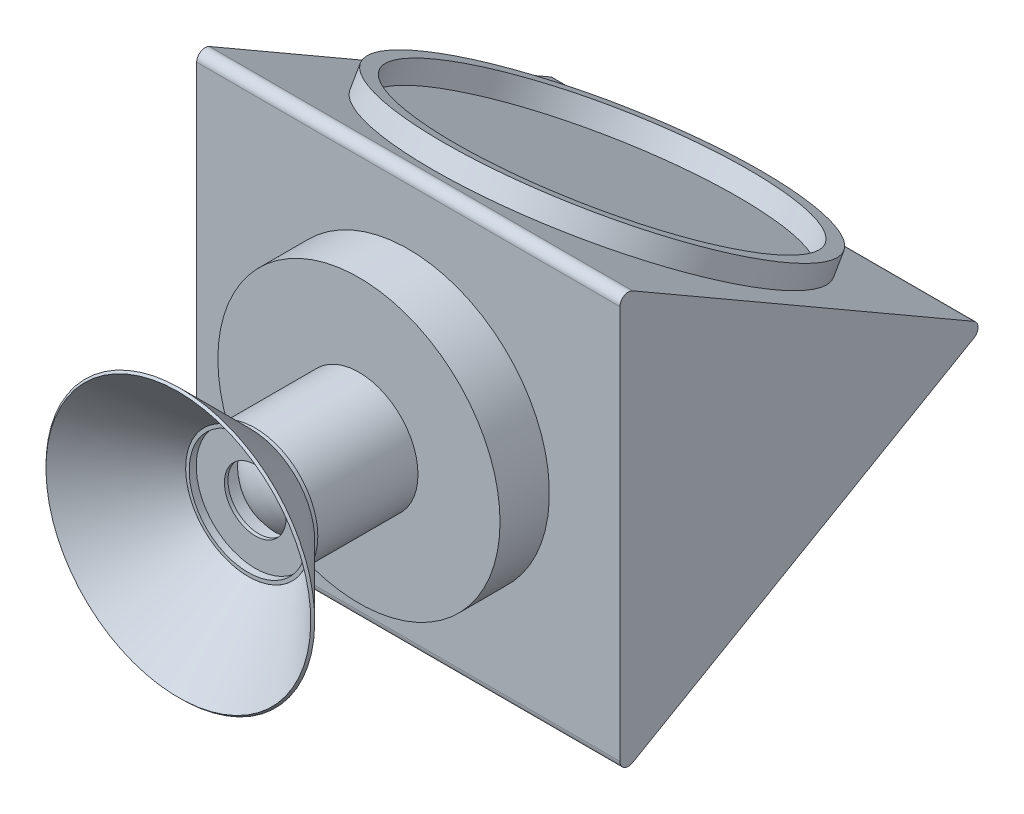
ISO-10303-21;
HEADER;
FILE_DESCRIPTION(('STEP AP214'),'2;1');
FILE_NAME('part.step','',(''),(''),'','','');
FILE_SCHEMA(('AUTOMOTIVE_DESIGN { 1 0 10303 214 1 1 1 1 }'));
ENDSEC;
DATA;
#1=APPLICATION_CONTEXT('core data for automotive mechanical design processes');
#2=APPLICATION_PROTOCOL_DEFINITION('international standard','automotive_design',2000,#1);
#3=PRODUCT_CONTEXT('',#1,'mechanical');
#4=PRODUCT('Part','Part','',(#3));
#5=PRODUCT_RELATED_PRODUCT_CATEGORY('part','',(#4));
#6=PRODUCT_DEFINITION_FORMATION('','',#4);
#7=PRODUCT_DEFINITION_CONTEXT('part definition',#1,'design');
#8=PRODUCT_DEFINITION('design','',#6,#7);
#9=PRODUCT_DEFINITION_SHAPE('','',#8);
#10=(LENGTH_UNIT() NAMED_UNIT(*) SI_UNIT(.MILLI.,.METRE.));
#11=(NAMED_UNIT(*) PLANE_ANGLE_UNIT() SI_UNIT($,.RADIAN.));
#12=(NAMED_UNIT(*) SI_UNIT($,.STERADIAN.) SOLID_ANGLE_UNIT());
#13=UNCERTAINTY_MEASURE_WITH_UNIT(LENGTH_MEASURE(1.E-05),#10,'distance_accuracy_value','');
#14=(GEOMETRIC_REPRESENTATION_CONTEXT(3) GLOBAL_UNCERTAINTY_ASSIGNED_CONTEXT((#13)) GLOBAL_UNIT_ASSIGNED_CONTEXT((#10,
#11,#12)) REPRESENTATION_CONTEXT('',''));
#15=CARTESIAN_POINT('',(0.,0.,0.));
#16=DIRECTION('',(0.,0.,1.));
#17=DIRECTION('',(1.,0.,0.));
#18=AXIS2_PLACEMENT_3D('',#15,#16,#17);
#19=CARTESIAN_POINT('',(750.,749.999999999999,560.428932188134));
#20=DIRECTION('',(0.,0.,1.));
#21=DIRECTION('',(0.,-1.,0.));
#22=AXIS2_PLACEMENT_3D('',#19,#20,#21);
#23=CONICAL_SURFACE('',#22,228.816947036011,0.785398163397448);
#24=CARTESIAN_POINT('',(750.,750.,807.916305603426));
#25=DIRECTION('',(0.,0.,-1.));
#26=DIRECTION('',(0.,1.,0.));
#27=AXIS2_PLACEMENT_3D('',#24,#25,#26);
#28=CIRCLE('',#27,476.304320451303);
#29=CARTESIAN_POINT('',(750.,1226.3043204513,807.916305603426));
#30=VERTEX_POINT('',#29);
#31=EDGE_CURVE('E78',#30,#30,#28,.T.);
#32=ORIENTED_EDGE('',*,*,#31,.T.);
#33=EDGE_LOOP('',(#32));
#34=FACE_BOUND('',#33,.T.);
#35=CARTESIAN_POINT('',(750.,749.999999999999,560.428932188134));
#36=DIRECTION('',(0.,0.,-1.));
#37=DIRECTION('',(0.,1.,0.));
#38=AXIS2_PLACEMENT_3D('',#35,#36,#37);
#39=CIRCLE('',#38,228.816947036011);
#40=CARTESIAN_POINT('',(750.,978.81694703601,560.428932188134));
#41=VERTEX_POINT('',#40);
#42=EDGE_CURVE('E12',#41,#41,#39,.T.);
#43=ORIENTED_EDGE('',*,*,#42,.F.);
#44=EDGE_LOOP('',(#43));
#45=FACE_BOUND('',#44,.T.);
#46=ADVANCED_FACE('F64',(#34,#45),#23,.T.);
#47=CARTESIAN_POINT('',(750.,749.999999999999,560.428932188134));
#48=DIRECTION('',(0.,0.,-1.));
#49=DIRECTION('',(0.,1.,0.));
#50=AXIS2_PLACEMENT_3D('',#47,#48,#49);
#51=CONICAL_SURFACE('',#50,228.816947036011,0.785398163397433);
#52=CARTESIAN_POINT('',(750.,749.999999999999,567.5));
#53=DIRECTION('',(0.,0.,-1.));
#54=DIRECTION('',(0.,1.,0.));
#55=AXIS2_PLACEMENT_3D('',#52,#53,#54);
#56=CIRCLE('',#55,221.745879224146);
#57=CARTESIAN_POINT('',(750.,971.745879224145,567.5));
#58=VERTEX_POINT('',#57);
#59=EDGE_CURVE('E70',#58,#58,#56,.T.);
#60=ORIENTED_EDGE('',*,*,#59,.F.);
#61=EDGE_LOOP('',(#60));
#62=FACE_BOUND('',#61,.T.);
#63=ORIENTED_EDGE('',*,*,#42,.T.);
#64=EDGE_LOOP('',(#63));
#65=FACE_BOUND('',#64,.T.);
#66=ADVANCED_FACE('F94',(#62,#65),#51,.F.);
#67=CARTESIAN_POINT('',(750.,749.999999999999,567.5));
#68=DIRECTION('',(0.,0.,1.));
#69=DIRECTION('',(0.,-1.,0.));
#70=AXIS2_PLACEMENT_3D('',#67,#68,#69);
#71=CONICAL_SURFACE('',#70,221.745879224146,0.785398163397449);
#72=CARTESIAN_POINT('',(750.,750.,814.987373415291));
#73=DIRECTION('',(0.,0.,-1.));
#74=DIRECTION('',(0.,1.,0.));
#75=AXIS2_PLACEMENT_3D('',#72,#73,#74);
#76=CIRCLE('',#75,469.233252639437);
#77=CARTESIAN_POINT('',(750.,1219.23325263944,814.987373415291));
#78=VERTEX_POINT('',#77);
#79=EDGE_CURVE('E74',#78,#78,#76,.T.);
#80=ORIENTED_EDGE('',*,*,#79,.F.);
#81=EDGE_LOOP('',(#80));
#82=FACE_BOUND('',#81,.T.);
#83=ORIENTED_EDGE('',*,*,#59,.T.);
#84=EDGE_LOOP('',(#83));
#85=FACE_BOUND('',#84,.T.);
#86=ADVANCED_FACE('F89',(#82,#85),#71,.F.);
#87=CARTESIAN_POINT('',(750.,750.,814.987373415291));
#88=DIRECTION('',(0.,0.,-1.));
#89=DIRECTION('',(0.,1.,0.));
#90=AXIS2_PLACEMENT_3D('',#87,#88,#89);
#91=CONICAL_SURFACE('',#90,469.233252639437,0.785398163397464);
#92=ORIENTED_EDGE('',*,*,#31,.F.);
#93=EDGE_LOOP('',(#92));
#94=FACE_BOUND('',#93,.T.);
#95=ORIENTED_EDGE('',*,*,#79,.T.);
#96=EDGE_LOOP('',(#95));
#97=FACE_BOUND('',#96,.T.);
#98=ADVANCED_FACE('F86',(#94,#97),#91,.T.);
#99=CLOSED_SHELL('',(#46,#66,#86,#98));
#100=MANIFOLD_SOLID_BREP('B2',#99);
#101=CARTESIAN_POINT('',(750.,750.,567.5));
#102=DIRECTION('',(0.,0.,1.));
#103=DIRECTION('',(1.,0.,0.));
#104=AXIS2_PLACEMENT_3D('',#101,#102,#103);
#105=PLANE('',#104);
#106=CARTESIAN_POINT('',(750.,750.,567.5));
#107=DIRECTION('',(0.,0.,1.));
#108=DIRECTION('',(1.,0.,0.));
#109=AXIS2_PLACEMENT_3D('',#106,#107,#108);
#110=CIRCLE('',#109,221.745879224145);
#111=CARTESIAN_POINT('',(971.745879224145,750.,567.5));
#112=VERTEX_POINT('',#111);
#113=EDGE_CURVE('E63',#112,#112,#110,.T.);
#114=ORIENTED_EDGE('',*,*,#113,.T.);
#115=EDGE_LOOP('',(#114));
#116=FACE_BOUND('',#115,.T.);
#117=CARTESIAN_POINT('',(750.,750.,567.5));
#118=DIRECTION('',(0.,0.,1.));
#119=DIRECTION('',(1.,0.,0.));
#120=AXIS2_PLACEMENT_3D('',#117,#118,#119);
#121=CIRCLE('',#120,209.245879224145);
#122=CARTESIAN_POINT('',(959.245879224145,750.,567.5));
#123=VERTEX_POINT('',#122);
#124=EDGE_CURVE('E162',#123,#123,#121,.T.);
#125=ORIENTED_EDGE('',*,*,#124,.F.);
#126=EDGE_LOOP('',(#125));
#127=FACE_BOUND('',#126,.T.);
#128=ADVANCED_FACE('F151',(#116,#127),#105,.T.);
#129=CARTESIAN_POINT('',(750.,750.,542.5));
#130=DIRECTION('',(0.,0.,1.));
#131=DIRECTION('',(1.,0.,0.));
#132=AXIS2_PLACEMENT_3D('',#129,#130,#131);
#133=PLANE('',#132);
#134=CARTESIAN_POINT('',(750.,750.,542.5));
#135=DIRECTION('',(0.,0.,1.));
#136=DIRECTION('',(1.,0.,0.));
#137=AXIS2_PLACEMENT_3D('',#134,#135,#136);
#138=CIRCLE('',#137,221.745879224145);
#139=CARTESIAN_POINT('',(971.745879224145,750.,542.5));
#140=VERTEX_POINT('',#139);
#141=EDGE_CURVE('E155',#140,#140,#138,.T.);
#142=ORIENTED_EDGE('',*,*,#141,.F.);
#143=EDGE_LOOP('',(#142));
#144=FACE_BOUND('',#143,.T.);
#145=CARTESIAN_POINT('',(750.,750.,542.5));
#146=DIRECTION('',(0.,0.,1.));
#147=DIRECTION('',(1.,0.,0.));
#148=AXIS2_PLACEMENT_3D('',#145,#146,#147);
#149=CIRCLE('',#148,209.245879224145);
#150=CARTESIAN_POINT('',(959.245879224145,750.,542.5));
#151=VERTEX_POINT('',#150);
#152=EDGE_CURVE('E164',#151,#151,#149,.T.);
#153=ORIENTED_EDGE('',*,*,#152,.T.);
#154=EDGE_LOOP('',(#153));
#155=FACE_BOUND('',#154,.T.);
#156=ADVANCED_FACE('F174',(#144,#155),#133,.F.);
#157=CARTESIAN_POINT('',(750.,750.,567.5));
#158=DIRECTION('',(0.,0.,-1.));
#159=DIRECTION('',(-1.,0.,0.));
#160=AXIS2_PLACEMENT_3D('',#157,#158,#159);
#161=CYLINDRICAL_SURFACE('',#160,221.745879224145);
#162=ORIENTED_EDGE('',*,*,#113,.F.);
#163=EDGE_LOOP('',(#162));
#164=FACE_BOUND('',#163,.T.);
#165=ORIENTED_EDGE('',*,*,#141,.T.);
#166=EDGE_LOOP('',(#165));
#167=FACE_BOUND('',#166,.T.);
#168=ADVANCED_FACE('F153',(#164,#167),#161,.T.);
#169=CARTESIAN_POINT('',(750.,750.,567.5));
#170=DIRECTION('',(0.,0.,-1.));
#171=DIRECTION('',(-1.,0.,0.));
#172=AXIS2_PLACEMENT_3D('',#169,#170,#171);
#173=CYLINDRICAL_SURFACE('',#172,209.245879224145);
#174=ORIENTED_EDGE('',*,*,#124,.T.);
#175=EDGE_LOOP('',(#174));
#176=FACE_BOUND('',#175,.T.);
#177=ORIENTED_EDGE('',*,*,#152,.F.);
#178=EDGE_LOOP('',(#177));
#179=FACE_BOUND('',#178,.T.);
#180=ADVANCED_FACE('F170',(#176,#179),#173,.F.);
#181=CLOSED_SHELL('',(#128,#156,#168,#180));
#182=MANIFOLD_SOLID_BREP('B7',#181);
#183=CARTESIAN_POINT('',(1500.,749.999999999997,-1299.03810567666));
#184=DIRECTION('',(0.,0.86602540378444,0.499999999999998));
#185=DIRECTION('',(0.,-0.499999999999998,0.86602540378444));
#186=AXIS2_PLACEMENT_3D('',#183,#184,#185);
#187=PLANE('',#186);
#188=DIRECTION('',(0.,0.499999999999998,-0.86602540378444));
#189=VECTOR('',#188,1.);
#190=CARTESIAN_POINT('',(1500.,749.999999999997,-1299.03810567666));
#191=LINE('',#190,#189);
#192=CARTESIAN_POINT('',(1500.,25.9807621135332,-45.0000000000004));
#193=VERTEX_POINT('',#192);
#194=CARTESIAN_POINT('',(1500.,724.019237886464,-1254.03810567666));
#195=VERTEX_POINT('',#194);
#196=EDGE_CURVE('E304',#193,#195,#191,.T.);
#197=ORIENTED_EDGE('',*,*,#196,.F.);
#198=DIRECTION('',(-1.,0.,0.));
#199=VECTOR('',#198,1.);
#200=CARTESIAN_POINT('',(1500.,25.9807621135328,-44.9999999999997));
#201=LINE('',#200,#199);
#202=CARTESIAN_POINT('',(0.,25.9807621135332,-45.0000000000004));
#203=VERTEX_POINT('',#202);
#204=EDGE_CURVE('E318',#193,#203,#201,.T.);
#205=ORIENTED_EDGE('',*,*,#204,.T.);
#206=DIRECTION('',(0.,0.499999999999998,-0.86602540378444));
#207=VECTOR('',#206,1.);
#208=CARTESIAN_POINT('',(0.,749.999999999997,-1299.03810567666));
#209=LINE('',#208,#207);
#210=CARTESIAN_POINT('',(0.,724.019237886464,-1254.03810567666));
#211=VERTEX_POINT('',#210);
#212=EDGE_CURVE('E309',#203,#211,#209,.T.);
#213=ORIENTED_EDGE('',*,*,#212,.T.);
#214=DIRECTION('',(-1.,0.,0.));
#215=VECTOR('',#214,1.);
#216=CARTESIAN_POINT('',(1500.,724.019237886464,-1254.03810567666));
#217=LINE('',#216,#215);
#218=EDGE_CURVE('E316',#211,#195,#217,.F.);
#219=ORIENTED_EDGE('',*,*,#218,.T.);
#220=EDGE_LOOP('',(#197,#205,#213,#219));
#221=FACE_BOUND('',#220,.T.);
#222=ADVANCED_FACE('F229',(#221),#187,.F.);
#223=CARTESIAN_POINT('',(1500.,1500.,0.));
#224=DIRECTION('',(0.,-0.866025403784438,0.500000000000001));
#225=DIRECTION('',(0.,-0.500000000000001,-0.866025403784438));
#226=AXIS2_PLACEMENT_3D('',#223,#224,#225);
#227=PLANE('',#226);
#228=CARTESIAN_POINT('',(750.,1125.,-649.51905283833));
#229=DIRECTION('',(0.,-0.866025403784438,0.500000000000001));
#230=DIRECTION('',(0.,-0.500000000000001,-0.866025403784438));
#231=AXIS2_PLACEMENT_3D('',#228,#229,#230);
#232=CIRCLE('',#231,650.);
#233=CARTESIAN_POINT('',(750.,799.999999999998,-1212.43556529822));
#234=VERTEX_POINT('',#233);
#235=EDGE_CURVE('E149',#234,#234,#232,.F.);
#236=ORIENTED_EDGE('',*,*,#235,.F.);
#237=EDGE_LOOP('',(#236));
#238=FACE_BOUND('',#237,.T.);
#239=DIRECTION('',(0.,0.500000000000001,0.866025403784438));
#240=VECTOR('',#239,1.);
#241=CARTESIAN_POINT('',(1500.,1500.,0.));
#242=LINE('',#241,#240);
#243=CARTESIAN_POINT('',(1500.,775.98076211353,-1254.03810567666));
#244=VERTEX_POINT('',#243);
#245=CARTESIAN_POINT('',(1500.,1474.01923788647,-45.));
#246=VERTEX_POINT('',#245);
#247=EDGE_CURVE('E307',#244,#246,#242,.T.);
#248=ORIENTED_EDGE('',*,*,#247,.F.);
#249=DIRECTION('',(-1.,0.,0.));
#250=VECTOR('',#249,1.);
#251=CARTESIAN_POINT('',(1500.,775.98076211353,-1254.03810567666));
#252=LINE('',#251,#250);
#253=CARTESIAN_POINT('',(0.,775.98076211353,-1254.03810567666));
#254=VERTEX_POINT('',#253);
#255=EDGE_CURVE('E328',#244,#254,#252,.T.);
#256=ORIENTED_EDGE('',*,*,#255,.T.);
#257=DIRECTION('',(0.,0.500000000000001,0.866025403784438));
#258=VECTOR('',#257,1.);
#259=CARTESIAN_POINT('',(0.,1500.,0.));
#260=LINE('',#259,#258);
#261=CARTESIAN_POINT('',(0.,1474.01923788647,-45.));
#262=VERTEX_POINT('',#261);
#263=EDGE_CURVE('E305',#254,#262,#260,.T.);
#264=ORIENTED_EDGE('',*,*,#263,.T.);
#265=DIRECTION('',(-1.,0.,0.));
#266=VECTOR('',#265,1.);
#267=CARTESIAN_POINT('',(1500.,1474.01923788647,-45.));
#268=LINE('',#267,#266);
#269=EDGE_CURVE('E292',#262,#246,#268,.F.);
#270=ORIENTED_EDGE('',*,*,#269,.T.);
#271=EDGE_LOOP('',(#248,#256,#264,#270));
#272=FACE_BOUND('',#271,.T.);
#273=ADVANCED_FACE('F364',(#238,#272),#227,.F.);
#274=CARTESIAN_POINT('',(1500.,0.,0.));
#275=DIRECTION('',(0.,0.,-1.));
#276=DIRECTION('',(-1.,0.,0.));
#277=AXIS2_PLACEMENT_3D('',#274,#275,#276);
#278=PLANE('',#277);
#279=CARTESIAN_POINT('',(750.,750.,0.));
#280=DIRECTION('',(0.,0.,-1.));
#281=DIRECTION('',(-1.,0.,0.));
#282=AXIS2_PLACEMENT_3D('',#279,#280,#281);
#283=CIRCLE('',#282,500.);
#284=CARTESIAN_POINT('',(250.,750.,0.));
#285=VERTEX_POINT('',#284);
#286=EDGE_CURVE('E331',#285,#285,#283,.F.);
#287=ORIENTED_EDGE('',*,*,#286,.F.);
#288=EDGE_LOOP('',(#287));
#289=FACE_BOUND('',#288,.T.);
#290=DIRECTION('',(0.,-1.,0.));
#291=VECTOR('',#290,1.);
#292=CARTESIAN_POINT('',(0.,0.,0.));
#293=LINE('',#292,#291);
#294=CARTESIAN_POINT('',(0.,1448.03847577293,0.));
#295=VERTEX_POINT('',#294);
#296=CARTESIAN_POINT('',(0.,51.9615242270661,0.));
#297=VERTEX_POINT('',#296);
#298=EDGE_CURVE('E298',#295,#297,#293,.T.);
#299=ORIENTED_EDGE('',*,*,#298,.T.);
#300=DIRECTION('',(-1.,0.,0.));
#301=VECTOR('',#300,1.);
#302=CARTESIAN_POINT('',(1500.,51.9615242270661,0.));
#303=LINE('',#302,#301);
#304=CARTESIAN_POINT('',(1500.,51.9615242270661,0.));
#305=VERTEX_POINT('',#304);
#306=EDGE_CURVE('E252',#297,#305,#303,.F.);
#307=ORIENTED_EDGE('',*,*,#306,.T.);
#308=DIRECTION('',(0.,-1.,0.));
#309=VECTOR('',#308,1.);
#310=CARTESIAN_POINT('',(1500.,0.,0.));
#311=LINE('',#310,#309);
#312=CARTESIAN_POINT('',(1500.,1448.03847577293,0.));
#313=VERTEX_POINT('',#312);
#314=EDGE_CURVE('E299',#313,#305,#311,.T.);
#315=ORIENTED_EDGE('',*,*,#314,.F.);
#316=DIRECTION('',(-1.,0.,0.));
#317=VECTOR('',#316,1.);
#318=CARTESIAN_POINT('',(1500.,1448.03847577293,0.));
#319=LINE('',#318,#317);
#320=EDGE_CURVE('E290',#313,#295,#319,.T.);
#321=ORIENTED_EDGE('',*,*,#320,.T.);
#322=EDGE_LOOP('',(#299,#307,#315,#321));
#323=FACE_BOUND('',#322,.T.);
#324=ADVANCED_FACE('F297',(#289,#323),#278,.F.);
#325=CARTESIAN_POINT('',(1500.,0.,0.));
#326=DIRECTION('',(-1.,0.,0.));
#327=DIRECTION('',(0.,0.,1.));
#328=AXIS2_PLACEMENT_3D('',#325,#326,#327);
#329=PLANE('',#328);
#330=ORIENTED_EDGE('',*,*,#314,.T.);
#331=CARTESIAN_POINT('',(1500.,51.9615242270661,-30.));
#332=DIRECTION('',(-1.,0.,0.));
#333=DIRECTION('',(0.,0.,1.));
#334=AXIS2_PLACEMENT_3D('',#331,#332,#333);
#335=CIRCLE('',#334,30.);
#336=EDGE_CURVE('E326',#305,#193,#335,.F.);
#337=ORIENTED_EDGE('',*,*,#336,.T.);
#338=ORIENTED_EDGE('',*,*,#196,.T.);
#339=CARTESIAN_POINT('',(1500.,749.999999999997,-1239.03810567666));
#340=DIRECTION('',(-1.,0.,0.));
#341=DIRECTION('',(0.,0.,1.));
#342=AXIS2_PLACEMENT_3D('',#339,#340,#341);
#343=CIRCLE('',#342,30.);
#344=EDGE_CURVE('E244',#195,#244,#343,.F.);
#345=ORIENTED_EDGE('',*,*,#344,.T.);
#346=ORIENTED_EDGE('',*,*,#247,.T.);
#347=CARTESIAN_POINT('',(1500.,1448.03847577293,-30.));
#348=DIRECTION('',(-1.,0.,0.));
#349=DIRECTION('',(0.,0.,1.));
#350=AXIS2_PLACEMENT_3D('',#347,#348,#349);
#351=CIRCLE('',#350,30.);
#352=EDGE_CURVE('E314',#246,#313,#351,.F.);
#353=ORIENTED_EDGE('',*,*,#352,.T.);
#354=EDGE_LOOP('',(#330,#337,#338,#345,#346,#353));
#355=FACE_BOUND('',#354,.T.);
#356=ADVANCED_FACE('F386',(#355),#329,.F.);
#357=CARTESIAN_POINT('',(0.,0.,0.));
#358=DIRECTION('',(-1.,0.,0.));
#359=DIRECTION('',(0.,0.,1.));
#360=AXIS2_PLACEMENT_3D('',#357,#358,#359);
#361=PLANE('',#360);
#362=ORIENTED_EDGE('',*,*,#212,.F.);
#363=CARTESIAN_POINT('',(0.,51.9615242270661,-30.));
#364=DIRECTION('',(-1.,0.,0.));
#365=DIRECTION('',(0.,0.,1.));
#366=AXIS2_PLACEMENT_3D('',#363,#364,#365);
#367=CIRCLE('',#366,30.);
#368=EDGE_CURVE('E303',#203,#297,#367,.T.);
#369=ORIENTED_EDGE('',*,*,#368,.T.);
#370=ORIENTED_EDGE('',*,*,#298,.F.);
#371=CARTESIAN_POINT('',(0.,1448.03847577293,-30.));
#372=DIRECTION('',(-1.,0.,0.));
#373=DIRECTION('',(0.,0.,1.));
#374=AXIS2_PLACEMENT_3D('',#371,#372,#373);
#375=CIRCLE('',#374,30.);
#376=EDGE_CURVE('E286',#295,#262,#375,.T.);
#377=ORIENTED_EDGE('',*,*,#376,.T.);
#378=ORIENTED_EDGE('',*,*,#263,.F.);
#379=CARTESIAN_POINT('',(0.,749.999999999997,-1239.03810567666));
#380=DIRECTION('',(-1.,0.,0.));
#381=DIRECTION('',(0.,0.,1.));
#382=AXIS2_PLACEMENT_3D('',#379,#380,#381);
#383=CIRCLE('',#382,30.);
#384=EDGE_CURVE('E321',#254,#211,#383,.T.);
#385=ORIENTED_EDGE('',*,*,#384,.T.);
#386=EDGE_LOOP('',(#362,#369,#370,#377,#378,#385));
#387=FACE_BOUND('',#386,.T.);
#388=ADVANCED_FACE('F302',(#387),#361,.T.);
#389=CARTESIAN_POINT('',(1500.,1448.03847577293,-30.));
#390=DIRECTION('',(-1.,0.,0.));
#391=DIRECTION('',(0.,0.,1.));
#392=AXIS2_PLACEMENT_3D('',#389,#390,#391);
#393=CYLINDRICAL_SURFACE('',#392,30.);
#394=ORIENTED_EDGE('',*,*,#352,.F.);
#395=ORIENTED_EDGE('',*,*,#269,.F.);
#396=ORIENTED_EDGE('',*,*,#376,.F.);
#397=ORIENTED_EDGE('',*,*,#320,.F.);
#398=EDGE_LOOP('',(#394,#395,#396,#397));
#399=FACE_BOUND('',#398,.T.);
#400=ADVANCED_FACE('F289',(#399),#393,.T.);
#401=CARTESIAN_POINT('',(1500.,51.9615242270661,-30.));
#402=DIRECTION('',(-1.,0.,0.));
#403=DIRECTION('',(0.,0.,1.));
#404=AXIS2_PLACEMENT_3D('',#401,#402,#403);
#405=CYLINDRICAL_SURFACE('',#404,30.);
#406=ORIENTED_EDGE('',*,*,#336,.F.);
#407=ORIENTED_EDGE('',*,*,#306,.F.);
#408=ORIENTED_EDGE('',*,*,#368,.F.);
#409=ORIENTED_EDGE('',*,*,#204,.F.);
#410=EDGE_LOOP('',(#406,#407,#408,#409));
#411=FACE_BOUND('',#410,.T.);
#412=ADVANCED_FACE('F377',(#411),#405,.T.);
#413=CARTESIAN_POINT('',(1500.,749.999999999997,-1239.03810567666));
#414=DIRECTION('',(-1.,0.,0.));
#415=DIRECTION('',(0.,0.,1.));
#416=AXIS2_PLACEMENT_3D('',#413,#414,#415);
#417=CYLINDRICAL_SURFACE('',#416,30.);
#418=ORIENTED_EDGE('',*,*,#344,.F.);
#419=ORIENTED_EDGE('',*,*,#218,.F.);
#420=ORIENTED_EDGE('',*,*,#384,.F.);
#421=ORIENTED_EDGE('',*,*,#255,.F.);
#422=EDGE_LOOP('',(#418,#419,#420,#421));
#423=FACE_BOUND('',#422,.T.);
#424=ADVANCED_FACE('F231',(#423),#417,.T.);
#425=CARTESIAN_POINT('',(750.,750.,175.));
#426=DIRECTION('',(0.,0.,-1.));
#427=DIRECTION('',(-1.,0.,0.));
#428=AXIS2_PLACEMENT_3D('',#425,#426,#427);
#429=CYLINDRICAL_SURFACE('',#428,500.);
#430=CARTESIAN_POINT('',(750.,750.,175.));
#431=DIRECTION('',(0.,0.,1.));
#432=DIRECTION('',(1.,0.,0.));
#433=AXIS2_PLACEMENT_3D('',#430,#431,#432);
#434=CIRCLE('',#433,500.);
#435=CARTESIAN_POINT('',(1250.,750.,175.));
#436=VERTEX_POINT('',#435);
#437=EDGE_CURVE('E391',#436,#436,#434,.T.);
#438=ORIENTED_EDGE('',*,*,#437,.F.);
#439=EDGE_LOOP('',(#438));
#440=FACE_BOUND('',#439,.T.);
#441=ORIENTED_EDGE('',*,*,#286,.T.);
#442=EDGE_LOOP('',(#441));
#443=FACE_BOUND('',#442,.T.);
#444=ADVANCED_FACE('F361',(#440,#443),#429,.T.);
#445=CARTESIAN_POINT('',(750.,750.,175.));
#446=DIRECTION('',(0.,0.,1.));
#447=DIRECTION('',(1.,0.,0.));
#448=AXIS2_PLACEMENT_3D('',#445,#446,#447);
#449=PLANE('',#448);
#450=CARTESIAN_POINT('',(750.,749.999999999997,175.));
#451=DIRECTION('',(0.,0.,1.));
#452=DIRECTION('',(1.,0.,0.));
#453=AXIS2_PLACEMENT_3D('',#450,#451,#452);
#454=CIRCLE('',#453,209.245879224143);
#455=CARTESIAN_POINT('',(959.245879224143,749.999999999997,175.));
#456=VERTEX_POINT('',#455);
#457=EDGE_CURVE('E402',#456,#456,#454,.T.);
#458=ORIENTED_EDGE('',*,*,#457,.F.);
#459=EDGE_LOOP('',(#458));
#460=FACE_BOUND('',#459,.T.);
#461=ORIENTED_EDGE('',*,*,#437,.T.);
#462=EDGE_LOOP('',(#461));
#463=FACE_BOUND('',#462,.T.);
#464=ADVANCED_FACE('F343',(#460,#463),#449,.T.);
#465=CARTESIAN_POINT('',(750.,749.999999999997,530.));
#466=DIRECTION('',(0.,0.,-1.));
#467=DIRECTION('',(-1.,0.,0.));
#468=AXIS2_PLACEMENT_3D('',#465,#466,#467);
#469=CYLINDRICAL_SURFACE('',#468,209.245879224143);
#470=ORIENTED_EDGE('',*,*,#457,.T.);
#471=EDGE_LOOP('',(#470));
#472=FACE_BOUND('',#471,.T.);
#473=CARTESIAN_POINT('',(750.,750.,542.5));
#474=DIRECTION('',(0.,0.,1.));
#475=DIRECTION('',(1.,0.,0.));
#476=AXIS2_PLACEMENT_3D('',#473,#474,#475);
#477=CIRCLE('',#476,209.245879224145);
#478=CARTESIAN_POINT('',(959.245879224144,750.,542.5));
#479=VERTEX_POINT('',#478);
#480=EDGE_CURVE('E408',#479,#479,#477,.T.);
#481=ORIENTED_EDGE('',*,*,#480,.F.);
#482=EDGE_LOOP('',(#481));
#483=FACE_BOUND('',#482,.T.);
#484=ADVANCED_FACE('F360',(#472,#483),#469,.T.);
#485=CARTESIAN_POINT('',(750.,750.,530.));
#486=DIRECTION('',(0.,0.,1.));
#487=DIRECTION('',(1.,0.,0.));
#488=AXIS2_PLACEMENT_3D('',#485,#486,#487);
#489=PLANE('',#488);
#490=CARTESIAN_POINT('',(750.,750.,530.));
#491=DIRECTION('',(0.,0.,1.));
#492=DIRECTION('',(1.,0.,0.));
#493=AXIS2_PLACEMENT_3D('',#490,#491,#492);
#494=CIRCLE('',#493,109.245879224145);
#495=CARTESIAN_POINT('',(859.245879224145,750.,530.));
#496=VERTEX_POINT('',#495);
#497=EDGE_CURVE('E412',#496,#496,#494,.T.);
#498=ORIENTED_EDGE('',*,*,#497,.T.);
#499=EDGE_LOOP('',(#498));
#500=FACE_BOUND('',#499,.T.);
#501=CARTESIAN_POINT('',(750.,749.999999999997,530.));
#502=DIRECTION('',(0.,0.,1.));
#503=DIRECTION('',(1.,0.,0.));
#504=AXIS2_PLACEMENT_3D('',#501,#502,#503);
#505=CIRCLE('',#504,199.245879224143);
#506=CARTESIAN_POINT('',(949.245879224143,749.999999999997,530.));
#507=VERTEX_POINT('',#506);
#508=EDGE_CURVE('E405',#507,#507,#505,.T.);
#509=ORIENTED_EDGE('',*,*,#508,.F.);
#510=EDGE_LOOP('',(#509));
#511=FACE_BOUND('',#510,.T.);
#512=ADVANCED_FACE('F449',(#500,#511),#489,.F.);
#513=CARTESIAN_POINT('',(750.,750.,542.5));
#514=DIRECTION('',(0.,0.,1.));
#515=DIRECTION('',(1.,0.,0.));
#516=AXIS2_PLACEMENT_3D('',#513,#514,#515);
#517=PLANE('',#516);
#518=ORIENTED_EDGE('',*,*,#480,.T.);
#519=EDGE_LOOP('',(#518));
#520=FACE_BOUND('',#519,.T.);
#521=CARTESIAN_POINT('',(750.,750.,542.5));
#522=DIRECTION('',(0.,0.,1.));
#523=DIRECTION('',(1.,0.,0.));
#524=AXIS2_PLACEMENT_3D('',#521,#522,#523);
#525=CIRCLE('',#524,109.245879224145);
#526=CARTESIAN_POINT('',(859.245879224145,750.,542.5));
#527=VERTEX_POINT('',#526);
#528=EDGE_CURVE('E411',#527,#527,#525,.T.);
#529=ORIENTED_EDGE('',*,*,#528,.F.);
#530=EDGE_LOOP('',(#529));
#531=FACE_BOUND('',#530,.T.);
#532=ADVANCED_FACE('F445',(#520,#531),#517,.T.);
#533=CARTESIAN_POINT('',(750.,750.,542.5));
#534=DIRECTION('',(0.,0.,-1.));
#535=DIRECTION('',(-1.,0.,0.));
#536=AXIS2_PLACEMENT_3D('',#533,#534,#535);
#537=CYLINDRICAL_SURFACE('',#536,109.245879224145);
#538=ORIENTED_EDGE('',*,*,#528,.T.);
#539=EDGE_LOOP('',(#538));
#540=FACE_BOUND('',#539,.T.);
#541=ORIENTED_EDGE('',*,*,#497,.F.);
#542=EDGE_LOOP('',(#541));
#543=FACE_BOUND('',#542,.T.);
#544=ADVANCED_FACE('F442',(#540,#543),#537,.F.);
#545=CARTESIAN_POINT('',(750.,749.999999999997,330.971453986437));
#546=DIRECTION('',(0.,0.,-1.));
#547=DIRECTION('',(0.,1.,0.));
#548=AXIS2_PLACEMENT_3D('',#545,#546,#547);
#549=SPHERICAL_SURFACE('',#548,194.028546013563);
#550=CARTESIAN_POINT('',(750.,749.999999999998,424.999999999999));
#551=DIRECTION('',(0.,0.,-1.));
#552=DIRECTION('',(0.,1.,0.));
#553=AXIS2_PLACEMENT_3D('',#550,#551,#552);
#554=CIRCLE('',#553,169.722447551031);
#555=CARTESIAN_POINT('',(750.,919.722447551029,425.));
#556=VERTEX_POINT('',#555);
#557=EDGE_CURVE('E393',#556,#556,#554,.T.);
#558=ORIENTED_EDGE('',*,*,#557,.F.);
#559=EDGE_LOOP('',(#558));
#560=FACE_BOUND('',#559,.T.);
#561=ADVANCED_FACE('F353',(#560),#549,.T.);
#562=CARTESIAN_POINT('',(750.,750.,175.));
#563=DIRECTION('',(0.,0.,-1.));
#564=DIRECTION('',(0.,1.,0.));
#565=AXIS2_PLACEMENT_3D('',#562,#563,#564);
#566=CYLINDRICAL_SURFACE('',#565,169.72244755103);
#567=ORIENTED_EDGE('',*,*,#557,.T.);
#568=EDGE_LOOP('',(#567));
#569=FACE_BOUND('',#568,.T.);
#570=CARTESIAN_POINT('',(750.,750.,174.999999999999));
#571=DIRECTION('',(0.,0.,-1.));
#572=DIRECTION('',(0.,1.,0.));
#573=AXIS2_PLACEMENT_3D('',#570,#571,#572);
#574=CIRCLE('',#573,169.722447551029);
#575=CARTESIAN_POINT('',(750.,919.722447551029,175.));
#576=VERTEX_POINT('',#575);
#577=EDGE_CURVE('E400',#576,#576,#574,.T.);
#578=ORIENTED_EDGE('',*,*,#577,.F.);
#579=EDGE_LOOP('',(#578));
#580=FACE_BOUND('',#579,.T.);
#581=ADVANCED_FACE('F340',(#569,#580),#566,.T.);
#582=ORIENTED_EDGE('',*,*,#577,.T.);
#583=EDGE_LOOP('',(#582));
#584=FACE_BOUND('',#583,.T.);
#585=CARTESIAN_POINT('',(750.,749.999999999997,175.));
#586=DIRECTION('',(0.,0.,1.));
#587=DIRECTION('',(1.,0.,0.));
#588=AXIS2_PLACEMENT_3D('',#585,#586,#587);
#589=CIRCLE('',#588,199.245879224143);
#590=CARTESIAN_POINT('',(949.245879224143,749.999999999997,175.));
#591=VERTEX_POINT('',#590);
#592=EDGE_CURVE('E237',#591,#591,#589,.F.);
#593=ORIENTED_EDGE('',*,*,#592,.F.);
#594=EDGE_LOOP('',(#593));
#595=FACE_BOUND('',#594,.T.);
#596=ADVANCED_FACE('F338',(#584,#595),#449,.T.);
#597=CARTESIAN_POINT('',(750.,749.999999999997,530.));
#598=DIRECTION('',(0.,0.,-1.));
#599=DIRECTION('',(-1.,0.,0.));
#600=AXIS2_PLACEMENT_3D('',#597,#598,#599);
#601=CYLINDRICAL_SURFACE('',#600,199.245879224143);
#602=ORIENTED_EDGE('',*,*,#508,.T.);
#603=EDGE_LOOP('',(#602));
#604=FACE_BOUND('',#603,.T.);
#605=ORIENTED_EDGE('',*,*,#592,.T.);
#606=EDGE_LOOP('',(#605));
#607=FACE_BOUND('',#606,.T.);
#608=ADVANCED_FACE('F336',(#604,#607),#601,.F.);
#609=CARTESIAN_POINT('',(750.,1189.95190528383,-687.01905283833));
#610=DIRECTION('',(0.,0.866025403784438,-0.500000000000001));
#611=DIRECTION('',(0.,0.500000000000001,0.866025403784438));
#612=AXIS2_PLACEMENT_3D('',#609,#610,#611);
#613=PLANE('',#612);
#614=CARTESIAN_POINT('',(750.,1189.95190528383,-687.01905283833));
#615=DIRECTION('',(0.,0.866025403784438,-0.500000000000001));
#616=DIRECTION('',(0.,0.500000000000001,0.866025403784438));
#617=AXIS2_PLACEMENT_3D('',#614,#615,#616);
#618=CIRCLE('',#617,650.);
#619=CARTESIAN_POINT('',(750.,1514.95190528383,-124.102540378445));
#620=VERTEX_POINT('',#619);
#621=EDGE_CURVE('E415',#620,#620,#618,.T.);
#622=ORIENTED_EDGE('',*,*,#621,.T.);
#623=EDGE_LOOP('',(#622));
#624=FACE_BOUND('',#623,.T.);
#625=CARTESIAN_POINT('',(750.,1189.95190528383,-687.01905283833));
#626=DIRECTION('',(0.,0.866025403784438,-0.500000000000001));
#627=DIRECTION('',(0.,0.500000000000001,0.866025403784438));
#628=AXIS2_PLACEMENT_3D('',#625,#626,#627);
#629=CIRCLE('',#628,600.);
#630=CARTESIAN_POINT('',(750.,1489.95190528383,-167.403810567667));
#631=VERTEX_POINT('',#630);
#632=EDGE_CURVE('E420',#631,#631,#629,.T.);
#633=ORIENTED_EDGE('',*,*,#632,.F.);
#634=EDGE_LOOP('',(#633));
#635=FACE_BOUND('',#634,.T.);
#636=ADVANCED_FACE('F349',(#624,#635),#613,.T.);
#637=CARTESIAN_POINT('',(750.,1189.95190528383,-687.01905283833));
#638=DIRECTION('',(0.,-0.866025403784438,0.500000000000001));
#639=DIRECTION('',(0.,-0.500000000000001,-0.866025403784438));
#640=AXIS2_PLACEMENT_3D('',#637,#638,#639);
#641=CYLINDRICAL_SURFACE('',#640,650.);
#642=ORIENTED_EDGE('',*,*,#621,.F.);
#643=EDGE_LOOP('',(#642));
#644=FACE_BOUND('',#643,.T.);
#645=ORIENTED_EDGE('',*,*,#235,.T.);
#646=EDGE_LOOP('',(#645));
#647=FACE_BOUND('',#646,.T.);
#648=ADVANCED_FACE('F431',(#644,#647),#641,.T.);
#649=CARTESIAN_POINT('',(750.,1189.95190528383,-687.01905283833));
#650=DIRECTION('',(0.,-0.866025403784438,0.500000000000001));
#651=DIRECTION('',(0.,-0.500000000000001,-0.866025403784438));
#652=AXIS2_PLACEMENT_3D('',#649,#650,#651);
#653=CYLINDRICAL_SURFACE('',#652,600.);
#654=ORIENTED_EDGE('',*,*,#632,.T.);
#655=EDGE_LOOP('',(#654));
#656=FACE_BOUND('',#655,.T.);
#657=CARTESIAN_POINT('',(750.,1125.,-649.51905283833));
#658=DIRECTION('',(0.,0.866025403784438,-0.500000000000001));
#659=DIRECTION('',(0.,0.500000000000001,0.866025403784438));
#660=AXIS2_PLACEMENT_3D('',#657,#658,#659);
#661=CIRCLE('',#660,600.);
#662=CARTESIAN_POINT('',(750.,1425.,-129.903810567667));
#663=VERTEX_POINT('',#662);
#664=EDGE_CURVE('E421',#663,#663,#661,.T.);
#665=ORIENTED_EDGE('',*,*,#664,.F.);
#666=EDGE_LOOP('',(#665));
#667=FACE_BOUND('',#666,.T.);
#668=ADVANCED_FACE('F427',(#656,#667),#653,.F.);
#669=ORIENTED_EDGE('',*,*,#664,.T.);
#670=EDGE_LOOP('',(#669));
#671=FACE_BOUND('',#670,.T.);
#672=ADVANCED_FACE('F372',(#671),#227,.F.);
#673=CLOSED_SHELL('',(#222,#273,#324,#356,#388,#400,#412,#424,#444,#464,#484,#512,#532,#544,
#561,#581,#596,#608,#636,#648,#668,#672));
#674=MANIFOLD_SOLID_BREP('B58',#673);
#675=ADVANCED_BREP_SHAPE_REPRESENTATION('',(#18,#100,#182,#674),#14);
#676=SHAPE_DEFINITION_REPRESENTATION(#9,#675);
ENDSEC;
END-ISO-10303-21;
